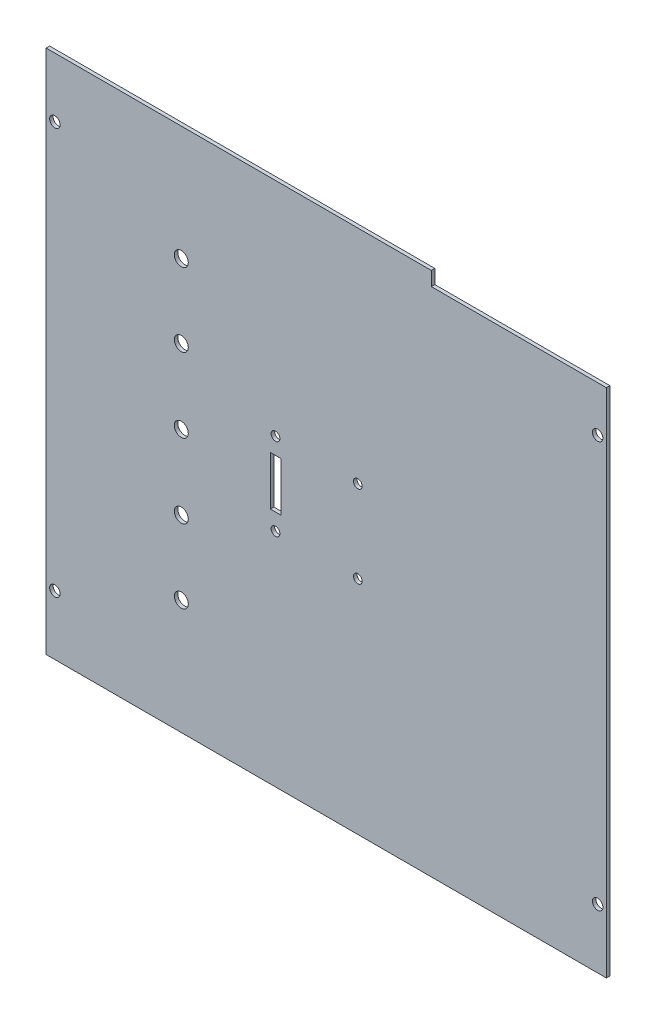
ISO-10303-21;
HEADER;
FILE_DESCRIPTION(('STEP AP214'),'2;1');
FILE_NAME('part.step','',(''),(''),'','','');
FILE_SCHEMA(('AUTOMOTIVE_DESIGN { 1 0 10303 214 1 1 1 1 }'));
ENDSEC;
DATA;
#1=APPLICATION_CONTEXT('core data for automotive mechanical design processes');
#2=APPLICATION_PROTOCOL_DEFINITION('international standard','automotive_design',2000,#1);
#3=PRODUCT_CONTEXT('',#1,'mechanical');
#4=PRODUCT('Part','Part','',(#3));
#5=PRODUCT_RELATED_PRODUCT_CATEGORY('part','',(#4));
#6=PRODUCT_DEFINITION_FORMATION('','',#4);
#7=PRODUCT_DEFINITION_CONTEXT('part definition',#1,'design');
#8=PRODUCT_DEFINITION('design','',#6,#7);
#9=PRODUCT_DEFINITION_SHAPE('','',#8);
#10=(LENGTH_UNIT() NAMED_UNIT(*) SI_UNIT(.MILLI.,.METRE.));
#11=(NAMED_UNIT(*) PLANE_ANGLE_UNIT() SI_UNIT($,.RADIAN.));
#12=(NAMED_UNIT(*) SI_UNIT($,.STERADIAN.) SOLID_ANGLE_UNIT());
#13=UNCERTAINTY_MEASURE_WITH_UNIT(LENGTH_MEASURE(1.E-05),#10,'distance_accuracy_value','');
#14=(GEOMETRIC_REPRESENTATION_CONTEXT(3) GLOBAL_UNCERTAINTY_ASSIGNED_CONTEXT((#13)) GLOBAL_UNIT_ASSIGNED_CONTEXT((#10,
#11,#12)) REPRESENTATION_CONTEXT('',''));
#15=CARTESIAN_POINT('',(0.,0.,0.));
#16=DIRECTION('',(0.,0.,1.));
#17=DIRECTION('',(1.,0.,0.));
#18=AXIS2_PLACEMENT_3D('',#15,#16,#17);
#19=CARTESIAN_POINT('',(80.,75.,1.));
#20=DIRECTION('',(-1.,0.,0.));
#21=DIRECTION('',(0.,0.,1.));
#22=AXIS2_PLACEMENT_3D('',#19,#20,#21);
#23=PLANE('',#22);
#24=DIRECTION('',(0.,1.,0.));
#25=VECTOR('',#24,1.);
#26=CARTESIAN_POINT('',(80.,75.,0.));
#27=LINE('',#26,#25);
#28=CARTESIAN_POINT('',(80.,-75.,0.));
#29=VERTEX_POINT('',#28);
#30=CARTESIAN_POINT('',(80.,71.,0.));
#31=VERTEX_POINT('',#30);
#32=EDGE_CURVE('E196',#29,#31,#27,.T.);
#33=ORIENTED_EDGE('',*,*,#32,.T.);
#34=DIRECTION('',(0.,0.,1.));
#35=VECTOR('',#34,1.);
#36=CARTESIAN_POINT('',(80.,71.,-9.));
#37=LINE('',#36,#35);
#38=CARTESIAN_POINT('',(80.,71.,1.));
#39=VERTEX_POINT('',#38);
#40=EDGE_CURVE('E167',#31,#39,#37,.T.);
#41=ORIENTED_EDGE('',*,*,#40,.T.);
#42=DIRECTION('',(0.,1.,0.));
#43=VECTOR('',#42,1.);
#44=CARTESIAN_POINT('',(80.,75.,1.));
#45=LINE('',#44,#43);
#46=CARTESIAN_POINT('',(80.,-75.,1.));
#47=VERTEX_POINT('',#46);
#48=EDGE_CURVE('E185',#47,#39,#45,.T.);
#49=ORIENTED_EDGE('',*,*,#48,.F.);
#50=DIRECTION('',(0.,0.,-1.));
#51=VECTOR('',#50,1.);
#52=CARTESIAN_POINT('',(80.,-75.,1.));
#53=LINE('',#52,#51);
#54=EDGE_CURVE('E195',#47,#29,#53,.T.);
#55=ORIENTED_EDGE('',*,*,#54,.T.);
#56=EDGE_LOOP('',(#33,#41,#49,#55));
#57=FACE_BOUND('',#56,.T.);
#58=ADVANCED_FACE('F33',(#57),#23,.F.);
#59=CARTESIAN_POINT('',(-80.,75.,1.));
#60=DIRECTION('',(0.,-1.,0.));
#61=DIRECTION('',(0.,0.,-1.));
#62=AXIS2_PLACEMENT_3D('',#59,#60,#61);
#63=PLANE('',#62);
#64=DIRECTION('',(-1.,0.,0.));
#65=VECTOR('',#64,1.);
#66=CARTESIAN_POINT('',(-80.,75.,1.));
#67=LINE('',#66,#65);
#68=CARTESIAN_POINT('',(30.,75.,1.));
#69=VERTEX_POINT('',#68);
#70=CARTESIAN_POINT('',(-80.,75.,1.));
#71=VERTEX_POINT('',#70);
#72=EDGE_CURVE('E188',#69,#71,#67,.T.);
#73=ORIENTED_EDGE('',*,*,#72,.F.);
#74=DIRECTION('',(0.,0.,1.));
#75=VECTOR('',#74,1.);
#76=CARTESIAN_POINT('',(30.,75.,-9.));
#77=LINE('',#76,#75);
#78=CARTESIAN_POINT('',(30.,75.,0.));
#79=VERTEX_POINT('',#78);
#80=EDGE_CURVE('E171',#79,#69,#77,.T.);
#81=ORIENTED_EDGE('',*,*,#80,.F.);
#82=DIRECTION('',(-1.,0.,0.));
#83=VECTOR('',#82,1.);
#84=CARTESIAN_POINT('',(-80.,75.,0.));
#85=LINE('',#84,#83);
#86=CARTESIAN_POINT('',(-80.,75.,0.));
#87=VERTEX_POINT('',#86);
#88=EDGE_CURVE('E199',#79,#87,#85,.T.);
#89=ORIENTED_EDGE('',*,*,#88,.T.);
#90=DIRECTION('',(0.,0.,-1.));
#91=VECTOR('',#90,1.);
#92=CARTESIAN_POINT('',(-80.,75.,1.));
#93=LINE('',#92,#91);
#94=EDGE_CURVE('E209',#71,#87,#93,.T.);
#95=ORIENTED_EDGE('',*,*,#94,.F.);
#96=EDGE_LOOP('',(#73,#81,#89,#95));
#97=FACE_BOUND('',#96,.T.);
#98=ADVANCED_FACE('F276',(#97),#63,.F.);
#99=CARTESIAN_POINT('',(-80.,75.,1.));
#100=DIRECTION('',(1.,0.,0.));
#101=DIRECTION('',(0.,1.,0.));
#102=AXIS2_PLACEMENT_3D('',#99,#100,#101);
#103=PLANE('',#102);
#104=DIRECTION('',(0.,-1.,0.));
#105=VECTOR('',#104,1.);
#106=CARTESIAN_POINT('',(-80.,75.,0.));
#107=LINE('',#106,#105);
#108=CARTESIAN_POINT('',(-80.,-75.,0.));
#109=VERTEX_POINT('',#108);
#110=EDGE_CURVE('E201',#87,#109,#107,.T.);
#111=ORIENTED_EDGE('',*,*,#110,.T.);
#112=DIRECTION('',(0.,0.,-1.));
#113=VECTOR('',#112,1.);
#114=CARTESIAN_POINT('',(-80.,-75.,1.));
#115=LINE('',#114,#113);
#116=CARTESIAN_POINT('',(-80.,-75.,1.));
#117=VERTEX_POINT('',#116);
#118=EDGE_CURVE('E206',#117,#109,#115,.T.);
#119=ORIENTED_EDGE('',*,*,#118,.F.);
#120=DIRECTION('',(0.,-1.,0.));
#121=VECTOR('',#120,1.);
#122=CARTESIAN_POINT('',(-80.,75.,1.));
#123=LINE('',#122,#121);
#124=EDGE_CURVE('E191',#71,#117,#123,.T.);
#125=ORIENTED_EDGE('',*,*,#124,.F.);
#126=ORIENTED_EDGE('',*,*,#94,.T.);
#127=EDGE_LOOP('',(#111,#119,#125,#126));
#128=FACE_BOUND('',#127,.T.);
#129=ADVANCED_FACE('F281',(#128),#103,.F.);
#130=CARTESIAN_POINT('',(-80.,-75.,1.));
#131=DIRECTION('',(0.,1.,0.));
#132=DIRECTION('',(0.,0.,1.));
#133=AXIS2_PLACEMENT_3D('',#130,#131,#132);
#134=PLANE('',#133);
#135=DIRECTION('',(1.,0.,0.));
#136=VECTOR('',#135,1.);
#137=CARTESIAN_POINT('',(-80.,-75.,0.));
#138=LINE('',#137,#136);
#139=EDGE_CURVE('E189',#109,#29,#138,.T.);
#140=ORIENTED_EDGE('',*,*,#139,.T.);
#141=ORIENTED_EDGE('',*,*,#54,.F.);
#142=DIRECTION('',(1.,0.,0.));
#143=VECTOR('',#142,1.);
#144=CARTESIAN_POINT('',(-80.,-75.,1.));
#145=LINE('',#144,#143);
#146=EDGE_CURVE('E193',#117,#47,#145,.T.);
#147=ORIENTED_EDGE('',*,*,#146,.F.);
#148=ORIENTED_EDGE('',*,*,#118,.T.);
#149=EDGE_LOOP('',(#140,#141,#147,#148));
#150=FACE_BOUND('',#149,.T.);
#151=ADVANCED_FACE('F301',(#150),#134,.F.);
#152=CARTESIAN_POINT('',(0.,0.,1.));
#153=DIRECTION('',(0.,0.,1.));
#154=DIRECTION('',(1.,0.,0.));
#155=AXIS2_PLACEMENT_3D('',#152,#153,#154);
#156=PLANE('',#155);
#157=CARTESIAN_POINT('',(-14.4839159587222,11.75,1.));
#158=DIRECTION('',(0.,0.,1.));
#159=DIRECTION('',(-1.,0.,0.));
#160=AXIS2_PLACEMENT_3D('',#157,#158,#159);
#161=CIRCLE('',#160,1.25);
#162=CARTESIAN_POINT('',(-15.7339159587222,11.75,1.));
#163=VERTEX_POINT('',#162);
#164=EDGE_CURVE('E147',#163,#163,#161,.T.);
#165=ORIENTED_EDGE('',*,*,#164,.F.);
#166=EDGE_LOOP('',(#165));
#167=FACE_BOUND('',#166,.T.);
#168=CARTESIAN_POINT('',(9.01608404127784,11.75,1.));
#169=DIRECTION('',(0.,0.,1.));
#170=DIRECTION('',(-1.,0.,0.));
#171=AXIS2_PLACEMENT_3D('',#168,#169,#170);
#172=CIRCLE('',#171,1.25);
#173=CARTESIAN_POINT('',(7.76608404127784,11.75,1.));
#174=VERTEX_POINT('',#173);
#175=EDGE_CURVE('E158',#174,#174,#172,.T.);
#176=ORIENTED_EDGE('',*,*,#175,.F.);
#177=EDGE_LOOP('',(#176));
#178=FACE_BOUND('',#177,.T.);
#179=CARTESIAN_POINT('',(9.01608404127784,-11.75,1.));
#180=DIRECTION('',(0.,0.,1.));
#181=DIRECTION('',(1.,0.,0.));
#182=AXIS2_PLACEMENT_3D('',#179,#180,#181);
#183=CIRCLE('',#182,1.25);
#184=CARTESIAN_POINT('',(10.2660840412778,-11.75,1.));
#185=VERTEX_POINT('',#184);
#186=EDGE_CURVE('E155',#185,#185,#183,.T.);
#187=ORIENTED_EDGE('',*,*,#186,.F.);
#188=EDGE_LOOP('',(#187));
#189=FACE_BOUND('',#188,.T.);
#190=CARTESIAN_POINT('',(-14.4839159587222,-11.75,1.));
#191=DIRECTION('',(0.,0.,1.));
#192=DIRECTION('',(1.,0.,0.));
#193=AXIS2_PLACEMENT_3D('',#190,#191,#192);
#194=CIRCLE('',#193,1.25);
#195=CARTESIAN_POINT('',(-13.2339159587222,-11.75,1.));
#196=VERTEX_POINT('',#195);
#197=EDGE_CURVE('E151',#196,#196,#194,.T.);
#198=ORIENTED_EDGE('',*,*,#197,.F.);
#199=EDGE_LOOP('',(#198));
#200=FACE_BOUND('',#199,.T.);
#201=CARTESIAN_POINT('',(77.5,-58.,1.));
#202=DIRECTION('',(0.,0.,1.));
#203=DIRECTION('',(1.,0.,0.));
#204=AXIS2_PLACEMENT_3D('',#201,#202,#203);
#205=CIRCLE('',#204,1.5);
#206=CARTESIAN_POINT('',(79.,-58.,1.));
#207=VERTEX_POINT('',#206);
#208=EDGE_CURVE('E176',#207,#207,#205,.T.);
#209=ORIENTED_EDGE('',*,*,#208,.F.);
#210=EDGE_LOOP('',(#209));
#211=FACE_BOUND('',#210,.T.);
#212=CARTESIAN_POINT('',(77.5,58.,1.));
#213=DIRECTION('',(0.,0.,1.));
#214=DIRECTION('',(-1.,0.,0.));
#215=AXIS2_PLACEMENT_3D('',#212,#213,#214);
#216=CIRCLE('',#215,1.5);
#217=CARTESIAN_POINT('',(76.,58.,1.));
#218=VERTEX_POINT('',#217);
#219=EDGE_CURVE('E166',#218,#218,#216,.T.);
#220=ORIENTED_EDGE('',*,*,#219,.F.);
#221=EDGE_LOOP('',(#220));
#222=FACE_BOUND('',#221,.T.);
#223=CARTESIAN_POINT('',(-77.5,58.,1.));
#224=DIRECTION('',(0.,0.,1.));
#225=DIRECTION('',(-1.,0.,0.));
#226=AXIS2_PLACEMENT_3D('',#223,#224,#225);
#227=CIRCLE('',#226,1.5);
#228=CARTESIAN_POINT('',(-79.,58.,1.));
#229=VERTEX_POINT('',#228);
#230=EDGE_CURVE('E163',#229,#229,#227,.T.);
#231=ORIENTED_EDGE('',*,*,#230,.F.);
#232=EDGE_LOOP('',(#231));
#233=FACE_BOUND('',#232,.T.);
#234=DIRECTION('',(1.,0.,0.));
#235=VECTOR('',#234,1.);
#236=CARTESIAN_POINT('',(80.,71.,1.));
#237=LINE('',#236,#235);
#238=CARTESIAN_POINT('',(30.,71.,1.));
#239=VERTEX_POINT('',#238);
#240=EDGE_CURVE('E169',#239,#39,#237,.T.);
#241=ORIENTED_EDGE('',*,*,#240,.F.);
#242=DIRECTION('',(0.,-1.,0.));
#243=VECTOR('',#242,1.);
#244=CARTESIAN_POINT('',(30.,75.,1.));
#245=LINE('',#244,#243);
#246=EDGE_CURVE('E154',#69,#239,#245,.T.);
#247=ORIENTED_EDGE('',*,*,#246,.F.);
#248=ORIENTED_EDGE('',*,*,#72,.T.);
#249=ORIENTED_EDGE('',*,*,#124,.T.);
#250=ORIENTED_EDGE('',*,*,#146,.T.);
#251=ORIENTED_EDGE('',*,*,#48,.T.);
#252=EDGE_LOOP('',(#241,#247,#248,#249,#250,#251));
#253=FACE_BOUND('',#252,.T.);
#254=CARTESIAN_POINT('',(-41.4014767297682,42.218866746657,1.));
#255=DIRECTION('',(0.,0.,1.));
#256=DIRECTION('',(-1.,0.,0.));
#257=AXIS2_PLACEMENT_3D('',#254,#255,#256);
#258=CIRCLE('',#257,2.);
#259=CARTESIAN_POINT('',(-43.4014767297682,42.218866746657,1.));
#260=VERTEX_POINT('',#259);
#261=EDGE_CURVE('E511',#260,#260,#258,.T.);
#262=ORIENTED_EDGE('',*,*,#261,.F.);
#263=EDGE_LOOP('',(#262));
#264=FACE_BOUND('',#263,.T.);
#265=CARTESIAN_POINT('',(-41.4014767297682,-42.218866746657,1.));
#266=DIRECTION('',(0.,0.,1.));
#267=DIRECTION('',(1.,0.,0.));
#268=AXIS2_PLACEMENT_3D('',#265,#266,#267);
#269=CIRCLE('',#268,2.);
#270=CARTESIAN_POINT('',(-39.4014767297682,-42.218866746657,1.));
#271=VERTEX_POINT('',#270);
#272=EDGE_CURVE('E509',#271,#271,#269,.T.);
#273=ORIENTED_EDGE('',*,*,#272,.F.);
#274=EDGE_LOOP('',(#273));
#275=FACE_BOUND('',#274,.T.);
#276=CARTESIAN_POINT('',(-41.4014767297682,0.,1.));
#277=DIRECTION('',(0.,0.,1.));
#278=DIRECTION('',(1.,0.,0.));
#279=AXIS2_PLACEMENT_3D('',#276,#277,#278);
#280=CIRCLE('',#279,2.);
#281=CARTESIAN_POINT('',(-39.4014767297682,0.,1.));
#282=VERTEX_POINT('',#281);
#283=EDGE_CURVE('E144',#282,#282,#280,.T.);
#284=ORIENTED_EDGE('',*,*,#283,.F.);
#285=EDGE_LOOP('',(#284));
#286=FACE_BOUND('',#285,.T.);
#287=CARTESIAN_POINT('',(-41.4014767297682,-21.2156769889961,1.));
#288=DIRECTION('',(0.,0.,1.));
#289=DIRECTION('',(1.,0.,0.));
#290=AXIS2_PLACEMENT_3D('',#287,#288,#289);
#291=CIRCLE('',#290,2.);
#292=CARTESIAN_POINT('',(-39.4014767297682,-21.2156769889961,1.));
#293=VERTEX_POINT('',#292);
#294=EDGE_CURVE('E148',#293,#293,#291,.T.);
#295=ORIENTED_EDGE('',*,*,#294,.F.);
#296=EDGE_LOOP('',(#295));
#297=FACE_BOUND('',#296,.T.);
#298=CARTESIAN_POINT('',(-41.4014767297682,21.2156769889961,1.));
#299=DIRECTION('',(0.,0.,1.));
#300=DIRECTION('',(-1.,0.,0.));
#301=AXIS2_PLACEMENT_3D('',#298,#299,#300);
#302=CIRCLE('',#301,2.);
#303=CARTESIAN_POINT('',(-43.4014767297682,21.2156769889961,1.));
#304=VERTEX_POINT('',#303);
#305=EDGE_CURVE('E141',#304,#304,#302,.T.);
#306=ORIENTED_EDGE('',*,*,#305,.F.);
#307=EDGE_LOOP('',(#306));
#308=FACE_BOUND('',#307,.T.);
#309=DIRECTION('',(0.,1.,0.));
#310=VECTOR('',#309,1.);
#311=CARTESIAN_POINT('',(-12.9839159587222,-7.00000000000002,1.));
#312=LINE('',#311,#310);
#313=CARTESIAN_POINT('',(-12.9839159587222,-7.00000000000002,1.));
#314=VERTEX_POINT('',#313);
#315=CARTESIAN_POINT('',(-12.9839159587222,6.99999999999998,1.));
#316=VERTEX_POINT('',#315);
#317=EDGE_CURVE('E49',#314,#316,#312,.T.);
#318=ORIENTED_EDGE('',*,*,#317,.F.);
#319=DIRECTION('',(1.,0.,0.));
#320=VECTOR('',#319,1.);
#321=CARTESIAN_POINT('',(-15.9839159587222,-7.00000000000002,1.));
#322=LINE('',#321,#320);
#323=CARTESIAN_POINT('',(-15.9839159587222,-7.00000000000002,1.));
#324=VERTEX_POINT('',#323);
#325=EDGE_CURVE('E134',#324,#314,#322,.T.);
#326=ORIENTED_EDGE('',*,*,#325,.F.);
#327=DIRECTION('',(0.,-1.,0.));
#328=VECTOR('',#327,1.);
#329=CARTESIAN_POINT('',(-15.9839159587222,-7.00000000000002,1.));
#330=LINE('',#329,#328);
#331=CARTESIAN_POINT('',(-15.9839159587222,6.99999999999998,1.));
#332=VERTEX_POINT('',#331);
#333=EDGE_CURVE('E117',#332,#324,#330,.T.);
#334=ORIENTED_EDGE('',*,*,#333,.F.);
#335=DIRECTION('',(-1.,0.,0.));
#336=VECTOR('',#335,1.);
#337=CARTESIAN_POINT('',(-15.9839159587222,6.99999999999998,1.));
#338=LINE('',#337,#336);
#339=EDGE_CURVE('E127',#316,#332,#338,.T.);
#340=ORIENTED_EDGE('',*,*,#339,.F.);
#341=EDGE_LOOP('',(#318,#326,#334,#340));
#342=FACE_BOUND('',#341,.T.);
#343=CARTESIAN_POINT('',(-77.5,-58.,1.));
#344=DIRECTION('',(0.,0.,1.));
#345=DIRECTION('',(1.,0.,0.));
#346=AXIS2_PLACEMENT_3D('',#343,#344,#345);
#347=CIRCLE('',#346,1.5);
#348=CARTESIAN_POINT('',(-76.,-58.,1.));
#349=VERTEX_POINT('',#348);
#350=EDGE_CURVE('E179',#349,#349,#347,.T.);
#351=ORIENTED_EDGE('',*,*,#350,.F.);
#352=EDGE_LOOP('',(#351));
#353=FACE_BOUND('',#352,.T.);
#354=ADVANCED_FACE('F131',(#167,#178,#189,#200,#211,#222,#233,#253,#264,#275,#286,#297,#308,
#342,#353),#156,.T.);
#355=CARTESIAN_POINT('',(0.,0.,0.));
#356=DIRECTION('',(0.,0.,1.));
#357=DIRECTION('',(1.,0.,0.));
#358=AXIS2_PLACEMENT_3D('',#355,#356,#357);
#359=PLANE('',#358);
#360=CARTESIAN_POINT('',(-14.4839159587222,11.75,0.));
#361=DIRECTION('',(0.,0.,1.));
#362=DIRECTION('',(1.,0.,0.));
#363=AXIS2_PLACEMENT_3D('',#360,#361,#362);
#364=CIRCLE('',#363,1.25);
#365=CARTESIAN_POINT('',(-13.2339159587222,11.75,0.));
#366=VERTEX_POINT('',#365);
#367=EDGE_CURVE('E36',#366,#366,#364,.T.);
#368=ORIENTED_EDGE('',*,*,#367,.T.);
#369=EDGE_LOOP('',(#368));
#370=FACE_BOUND('',#369,.T.);
#371=CARTESIAN_POINT('',(9.01608404127784,11.75,0.));
#372=DIRECTION('',(0.,0.,1.));
#373=DIRECTION('',(1.,0.,0.));
#374=AXIS2_PLACEMENT_3D('',#371,#372,#373);
#375=CIRCLE('',#374,1.25);
#376=CARTESIAN_POINT('',(10.2660840412778,11.75,0.));
#377=VERTEX_POINT('',#376);
#378=EDGE_CURVE('E254',#377,#377,#375,.T.);
#379=ORIENTED_EDGE('',*,*,#378,.T.);
#380=EDGE_LOOP('',(#379));
#381=FACE_BOUND('',#380,.T.);
#382=CARTESIAN_POINT('',(9.01608404127784,-11.75,0.));
#383=DIRECTION('',(0.,0.,1.));
#384=DIRECTION('',(1.,0.,0.));
#385=AXIS2_PLACEMENT_3D('',#382,#383,#384);
#386=CIRCLE('',#385,1.25);
#387=CARTESIAN_POINT('',(10.2660840412778,-11.75,0.));
#388=VERTEX_POINT('',#387);
#389=EDGE_CURVE('E252',#388,#388,#386,.T.);
#390=ORIENTED_EDGE('',*,*,#389,.T.);
#391=EDGE_LOOP('',(#390));
#392=FACE_BOUND('',#391,.T.);
#393=CARTESIAN_POINT('',(-14.4839159587222,-11.75,0.));
#394=DIRECTION('',(0.,0.,1.));
#395=DIRECTION('',(1.,0.,0.));
#396=AXIS2_PLACEMENT_3D('',#393,#394,#395);
#397=CIRCLE('',#396,1.25);
#398=CARTESIAN_POINT('',(-13.2339159587222,-11.75,0.));
#399=VERTEX_POINT('',#398);
#400=EDGE_CURVE('E249',#399,#399,#397,.T.);
#401=ORIENTED_EDGE('',*,*,#400,.T.);
#402=EDGE_LOOP('',(#401));
#403=FACE_BOUND('',#402,.T.);
#404=CARTESIAN_POINT('',(77.5,-58.,0.));
#405=DIRECTION('',(0.,0.,1.));
#406=DIRECTION('',(1.,0.,0.));
#407=AXIS2_PLACEMENT_3D('',#404,#405,#406);
#408=CIRCLE('',#407,1.5);
#409=CARTESIAN_POINT('',(79.,-58.,0.));
#410=VERTEX_POINT('',#409);
#411=EDGE_CURVE('E246',#410,#410,#408,.T.);
#412=ORIENTED_EDGE('',*,*,#411,.T.);
#413=EDGE_LOOP('',(#412));
#414=FACE_BOUND('',#413,.T.);
#415=CARTESIAN_POINT('',(77.5,58.,0.));
#416=DIRECTION('',(0.,0.,1.));
#417=DIRECTION('',(1.,0.,0.));
#418=AXIS2_PLACEMENT_3D('',#415,#416,#417);
#419=CIRCLE('',#418,1.5);
#420=CARTESIAN_POINT('',(79.,58.,0.));
#421=VERTEX_POINT('',#420);
#422=EDGE_CURVE('E243',#421,#421,#419,.T.);
#423=ORIENTED_EDGE('',*,*,#422,.T.);
#424=EDGE_LOOP('',(#423));
#425=FACE_BOUND('',#424,.T.);
#426=CARTESIAN_POINT('',(-77.5,58.,0.));
#427=DIRECTION('',(0.,0.,1.));
#428=DIRECTION('',(1.,0.,0.));
#429=AXIS2_PLACEMENT_3D('',#426,#427,#428);
#430=CIRCLE('',#429,1.5);
#431=CARTESIAN_POINT('',(-76.,58.,0.));
#432=VERTEX_POINT('',#431);
#433=EDGE_CURVE('E238',#432,#432,#430,.T.);
#434=ORIENTED_EDGE('',*,*,#433,.T.);
#435=EDGE_LOOP('',(#434));
#436=FACE_BOUND('',#435,.T.);
#437=CARTESIAN_POINT('',(-41.4014767297682,42.218866746657,0.));
#438=DIRECTION('',(0.,0.,1.));
#439=DIRECTION('',(1.,0.,0.));
#440=AXIS2_PLACEMENT_3D('',#437,#438,#439);
#441=CIRCLE('',#440,2.);
#442=CARTESIAN_POINT('',(-39.4014767297682,42.218866746657,0.));
#443=VERTEX_POINT('',#442);
#444=EDGE_CURVE('E235',#443,#443,#441,.T.);
#445=ORIENTED_EDGE('',*,*,#444,.T.);
#446=EDGE_LOOP('',(#445));
#447=FACE_BOUND('',#446,.T.);
#448=CARTESIAN_POINT('',(-41.4014767297682,-42.218866746657,0.));
#449=DIRECTION('',(0.,0.,1.));
#450=DIRECTION('',(1.,0.,0.));
#451=AXIS2_PLACEMENT_3D('',#448,#449,#450);
#452=CIRCLE('',#451,2.);
#453=CARTESIAN_POINT('',(-39.4014767297682,-42.218866746657,0.));
#454=VERTEX_POINT('',#453);
#455=EDGE_CURVE('E232',#454,#454,#452,.T.);
#456=ORIENTED_EDGE('',*,*,#455,.T.);
#457=EDGE_LOOP('',(#456));
#458=FACE_BOUND('',#457,.T.);
#459=CARTESIAN_POINT('',(-41.4014767297682,0.,0.));
#460=DIRECTION('',(0.,0.,1.));
#461=DIRECTION('',(1.,0.,0.));
#462=AXIS2_PLACEMENT_3D('',#459,#460,#461);
#463=CIRCLE('',#462,2.);
#464=CARTESIAN_POINT('',(-39.4014767297682,0.,0.));
#465=VERTEX_POINT('',#464);
#466=EDGE_CURVE('E229',#465,#465,#463,.T.);
#467=ORIENTED_EDGE('',*,*,#466,.T.);
#468=EDGE_LOOP('',(#467));
#469=FACE_BOUND('',#468,.T.);
#470=CARTESIAN_POINT('',(-41.4014767297682,-21.2156769889961,0.));
#471=DIRECTION('',(0.,0.,1.));
#472=DIRECTION('',(1.,0.,0.));
#473=AXIS2_PLACEMENT_3D('',#470,#471,#472);
#474=CIRCLE('',#473,2.);
#475=CARTESIAN_POINT('',(-39.4014767297682,-21.2156769889961,0.));
#476=VERTEX_POINT('',#475);
#477=EDGE_CURVE('E226',#476,#476,#474,.T.);
#478=ORIENTED_EDGE('',*,*,#477,.T.);
#479=EDGE_LOOP('',(#478));
#480=FACE_BOUND('',#479,.T.);
#481=CARTESIAN_POINT('',(-41.4014767297682,21.2156769889961,0.));
#482=DIRECTION('',(0.,0.,1.));
#483=DIRECTION('',(1.,0.,0.));
#484=AXIS2_PLACEMENT_3D('',#481,#482,#483);
#485=CIRCLE('',#484,2.);
#486=CARTESIAN_POINT('',(-39.4014767297682,21.2156769889961,0.));
#487=VERTEX_POINT('',#486);
#488=EDGE_CURVE('E215',#487,#487,#485,.T.);
#489=ORIENTED_EDGE('',*,*,#488,.T.);
#490=EDGE_LOOP('',(#489));
#491=FACE_BOUND('',#490,.T.);
#492=DIRECTION('',(1.,0.,0.));
#493=VECTOR('',#492,1.);
#494=CARTESIAN_POINT('',(0.,-7.00000000000002,0.));
#495=LINE('',#494,#493);
#496=CARTESIAN_POINT('',(-15.9839159587222,-7.00000000000002,0.));
#497=VERTEX_POINT('',#496);
#498=CARTESIAN_POINT('',(-12.9839159587222,-7.00000000000002,0.));
#499=VERTEX_POINT('',#498);
#500=EDGE_CURVE('E218',#497,#499,#495,.T.);
#501=ORIENTED_EDGE('',*,*,#500,.T.);
#502=DIRECTION('',(0.,1.,0.));
#503=VECTOR('',#502,1.);
#504=CARTESIAN_POINT('',(-12.9839159587222,0.,0.));
#505=LINE('',#504,#503);
#506=CARTESIAN_POINT('',(-12.9839159587222,6.99999999999998,0.));
#507=VERTEX_POINT('',#506);
#508=EDGE_CURVE('E221',#499,#507,#505,.T.);
#509=ORIENTED_EDGE('',*,*,#508,.T.);
#510=DIRECTION('',(-1.,0.,0.));
#511=VECTOR('',#510,1.);
#512=CARTESIAN_POINT('',(0.,6.99999999999998,0.));
#513=LINE('',#512,#511);
#514=CARTESIAN_POINT('',(-15.9839159587222,6.99999999999998,0.));
#515=VERTEX_POINT('',#514);
#516=EDGE_CURVE('E212',#507,#515,#513,.T.);
#517=ORIENTED_EDGE('',*,*,#516,.T.);
#518=DIRECTION('',(0.,-1.,0.));
#519=VECTOR('',#518,1.);
#520=CARTESIAN_POINT('',(-15.9839159587222,0.,0.));
#521=LINE('',#520,#519);
#522=EDGE_CURVE('E120',#515,#497,#521,.T.);
#523=ORIENTED_EDGE('',*,*,#522,.T.);
#524=EDGE_LOOP('',(#501,#509,#517,#523));
#525=FACE_BOUND('',#524,.T.);
#526=CARTESIAN_POINT('',(-77.5,-58.,0.));
#527=DIRECTION('',(0.,0.,1.));
#528=DIRECTION('',(1.,0.,0.));
#529=AXIS2_PLACEMENT_3D('',#526,#527,#528);
#530=CIRCLE('',#529,1.5);
#531=CARTESIAN_POINT('',(-76.,-58.,0.));
#532=VERTEX_POINT('',#531);
#533=EDGE_CURVE('E184',#532,#532,#530,.T.);
#534=ORIENTED_EDGE('',*,*,#533,.T.);
#535=EDGE_LOOP('',(#534));
#536=FACE_BOUND('',#535,.T.);
#537=DIRECTION('',(0.,-1.,0.));
#538=VECTOR('',#537,1.);
#539=CARTESIAN_POINT('',(30.,0.,0.));
#540=LINE('',#539,#538);
#541=CARTESIAN_POINT('',(30.,71.,0.));
#542=VERTEX_POINT('',#541);
#543=EDGE_CURVE('E41',#79,#542,#540,.T.);
#544=ORIENTED_EDGE('',*,*,#543,.T.);
#545=DIRECTION('',(1.,0.,0.));
#546=VECTOR('',#545,1.);
#547=CARTESIAN_POINT('',(0.,71.,0.));
#548=LINE('',#547,#546);
#549=EDGE_CURVE('E11',#542,#31,#548,.T.);
#550=ORIENTED_EDGE('',*,*,#549,.T.);
#551=ORIENTED_EDGE('',*,*,#32,.F.);
#552=ORIENTED_EDGE('',*,*,#139,.F.);
#553=ORIENTED_EDGE('',*,*,#110,.F.);
#554=ORIENTED_EDGE('',*,*,#88,.F.);
#555=EDGE_LOOP('',(#544,#550,#551,#552,#553,#554));
#556=FACE_BOUND('',#555,.T.);
#557=ADVANCED_FACE('F261',(#370,#381,#392,#403,#414,#425,#436,#447,#458,#469,#480,#491,#525,
#536,#556),#359,.F.);
#558=CARTESIAN_POINT('',(-77.5,-58.,-9.));
#559=DIRECTION('',(0.,0.,1.));
#560=DIRECTION('',(1.,0.,0.));
#561=AXIS2_PLACEMENT_3D('',#558,#559,#560);
#562=CYLINDRICAL_SURFACE('',#561,1.5);
#563=ORIENTED_EDGE('',*,*,#350,.T.);
#564=EDGE_LOOP('',(#563));
#565=FACE_BOUND('',#564,.T.);
#566=ORIENTED_EDGE('',*,*,#533,.F.);
#567=EDGE_LOOP('',(#566));
#568=FACE_BOUND('',#567,.T.);
#569=ADVANCED_FACE('F326',(#565,#568),#562,.F.);
#570=CARTESIAN_POINT('',(-12.9839159587222,-7.00000000000002,-9.));
#571=DIRECTION('',(1.,0.,0.));
#572=DIRECTION('',(0.,0.,-1.));
#573=AXIS2_PLACEMENT_3D('',#570,#571,#572);
#574=PLANE('',#573);
#575=DIRECTION('',(0.,0.,1.));
#576=VECTOR('',#575,1.);
#577=CARTESIAN_POINT('',(-12.9839159587222,-7.00000000000002,-9.));
#578=LINE('',#577,#576);
#579=EDGE_CURVE('E139',#499,#314,#578,.T.);
#580=ORIENTED_EDGE('',*,*,#579,.T.);
#581=ORIENTED_EDGE('',*,*,#317,.T.);
#582=DIRECTION('',(0.,0.,1.));
#583=VECTOR('',#582,1.);
#584=CARTESIAN_POINT('',(-12.9839159587222,6.99999999999998,-9.));
#585=LINE('',#584,#583);
#586=EDGE_CURVE('E124',#507,#316,#585,.T.);
#587=ORIENTED_EDGE('',*,*,#586,.F.);
#588=ORIENTED_EDGE('',*,*,#508,.F.);
#589=EDGE_LOOP('',(#580,#581,#587,#588));
#590=FACE_BOUND('',#589,.T.);
#591=ADVANCED_FACE('F329',(#590),#574,.F.);
#592=CARTESIAN_POINT('',(-15.9839159587222,-7.00000000000002,-9.));
#593=DIRECTION('',(0.,-1.,0.));
#594=DIRECTION('',(0.,0.,-1.));
#595=AXIS2_PLACEMENT_3D('',#592,#593,#594);
#596=PLANE('',#595);
#597=DIRECTION('',(0.,0.,1.));
#598=VECTOR('',#597,1.);
#599=CARTESIAN_POINT('',(-15.9839159587222,-7.00000000000002,-9.));
#600=LINE('',#599,#598);
#601=EDGE_CURVE('E123',#497,#324,#600,.T.);
#602=ORIENTED_EDGE('',*,*,#601,.T.);
#603=ORIENTED_EDGE('',*,*,#325,.T.);
#604=ORIENTED_EDGE('',*,*,#579,.F.);
#605=ORIENTED_EDGE('',*,*,#500,.F.);
#606=EDGE_LOOP('',(#602,#603,#604,#605));
#607=FACE_BOUND('',#606,.T.);
#608=ADVANCED_FACE('F365',(#607),#596,.F.);
#609=CARTESIAN_POINT('',(-15.9839159587222,-7.00000000000002,-9.));
#610=DIRECTION('',(-1.,0.,0.));
#611=DIRECTION('',(0.,0.,1.));
#612=AXIS2_PLACEMENT_3D('',#609,#610,#611);
#613=PLANE('',#612);
#614=DIRECTION('',(0.,0.,1.));
#615=VECTOR('',#614,1.);
#616=CARTESIAN_POINT('',(-15.9839159587222,6.99999999999998,-9.));
#617=LINE('',#616,#615);
#618=EDGE_CURVE('E112',#515,#332,#617,.T.);
#619=ORIENTED_EDGE('',*,*,#618,.T.);
#620=ORIENTED_EDGE('',*,*,#333,.T.);
#621=ORIENTED_EDGE('',*,*,#601,.F.);
#622=ORIENTED_EDGE('',*,*,#522,.F.);
#623=EDGE_LOOP('',(#619,#620,#621,#622));
#624=FACE_BOUND('',#623,.T.);
#625=ADVANCED_FACE('F114',(#624),#613,.F.);
#626=CARTESIAN_POINT('',(-15.9839159587222,6.99999999999998,-9.));
#627=DIRECTION('',(0.,1.,0.));
#628=DIRECTION('',(0.,0.,1.));
#629=AXIS2_PLACEMENT_3D('',#626,#627,#628);
#630=PLANE('',#629);
#631=ORIENTED_EDGE('',*,*,#586,.T.);
#632=ORIENTED_EDGE('',*,*,#339,.T.);
#633=ORIENTED_EDGE('',*,*,#618,.F.);
#634=ORIENTED_EDGE('',*,*,#516,.F.);
#635=EDGE_LOOP('',(#631,#632,#633,#634));
#636=FACE_BOUND('',#635,.T.);
#637=ADVANCED_FACE('F128',(#636),#630,.F.);
#638=CARTESIAN_POINT('',(-41.4014767297682,21.2156769889961,-9.));
#639=DIRECTION('',(0.,0.,1.));
#640=DIRECTION('',(1.,0.,0.));
#641=AXIS2_PLACEMENT_3D('',#638,#639,#640);
#642=CYLINDRICAL_SURFACE('',#641,2.);
#643=ORIENTED_EDGE('',*,*,#305,.T.);
#644=EDGE_LOOP('',(#643));
#645=FACE_BOUND('',#644,.T.);
#646=ORIENTED_EDGE('',*,*,#488,.F.);
#647=EDGE_LOOP('',(#646));
#648=FACE_BOUND('',#647,.T.);
#649=ADVANCED_FACE('F385',(#645,#648),#642,.F.);
#650=CARTESIAN_POINT('',(-41.4014767297682,-21.2156769889961,-9.));
#651=DIRECTION('',(0.,0.,1.));
#652=DIRECTION('',(1.,0.,0.));
#653=AXIS2_PLACEMENT_3D('',#650,#651,#652);
#654=CYLINDRICAL_SURFACE('',#653,2.);
#655=ORIENTED_EDGE('',*,*,#294,.T.);
#656=EDGE_LOOP('',(#655));
#657=FACE_BOUND('',#656,.T.);
#658=ORIENTED_EDGE('',*,*,#477,.F.);
#659=EDGE_LOOP('',(#658));
#660=FACE_BOUND('',#659,.T.);
#661=ADVANCED_FACE('F392',(#657,#660),#654,.F.);
#662=CARTESIAN_POINT('',(-41.4014767297682,0.,-9.));
#663=DIRECTION('',(0.,0.,1.));
#664=DIRECTION('',(1.,0.,0.));
#665=AXIS2_PLACEMENT_3D('',#662,#663,#664);
#666=CYLINDRICAL_SURFACE('',#665,2.);
#667=ORIENTED_EDGE('',*,*,#283,.T.);
#668=EDGE_LOOP('',(#667));
#669=FACE_BOUND('',#668,.T.);
#670=ORIENTED_EDGE('',*,*,#466,.F.);
#671=EDGE_LOOP('',(#670));
#672=FACE_BOUND('',#671,.T.);
#673=ADVANCED_FACE('F400',(#669,#672),#666,.F.);
#674=CARTESIAN_POINT('',(-41.4014767297682,-42.218866746657,-9.));
#675=DIRECTION('',(0.,0.,1.));
#676=DIRECTION('',(1.,0.,0.));
#677=AXIS2_PLACEMENT_3D('',#674,#675,#676);
#678=CYLINDRICAL_SURFACE('',#677,2.);
#679=ORIENTED_EDGE('',*,*,#272,.T.);
#680=EDGE_LOOP('',(#679));
#681=FACE_BOUND('',#680,.T.);
#682=ORIENTED_EDGE('',*,*,#455,.F.);
#683=EDGE_LOOP('',(#682));
#684=FACE_BOUND('',#683,.T.);
#685=ADVANCED_FACE('F408',(#681,#684),#678,.F.);
#686=CARTESIAN_POINT('',(-41.4014767297682,42.218866746657,-9.));
#687=DIRECTION('',(0.,0.,1.));
#688=DIRECTION('',(1.,0.,0.));
#689=AXIS2_PLACEMENT_3D('',#686,#687,#688);
#690=CYLINDRICAL_SURFACE('',#689,2.);
#691=ORIENTED_EDGE('',*,*,#261,.T.);
#692=EDGE_LOOP('',(#691));
#693=FACE_BOUND('',#692,.T.);
#694=ORIENTED_EDGE('',*,*,#444,.F.);
#695=EDGE_LOOP('',(#694));
#696=FACE_BOUND('',#695,.T.);
#697=ADVANCED_FACE('F315',(#693,#696),#690,.F.);
#698=CARTESIAN_POINT('',(80.,71.,-9.));
#699=DIRECTION('',(0.,-1.,0.));
#700=DIRECTION('',(0.,0.,-1.));
#701=AXIS2_PLACEMENT_3D('',#698,#699,#700);
#702=PLANE('',#701);
#703=DIRECTION('',(0.,0.,1.));
#704=VECTOR('',#703,1.);
#705=CARTESIAN_POINT('',(30.,71.,-9.));
#706=LINE('',#705,#704);
#707=EDGE_CURVE('E57',#542,#239,#706,.T.);
#708=ORIENTED_EDGE('',*,*,#707,.T.);
#709=ORIENTED_EDGE('',*,*,#240,.T.);
#710=ORIENTED_EDGE('',*,*,#40,.F.);
#711=ORIENTED_EDGE('',*,*,#549,.F.);
#712=EDGE_LOOP('',(#708,#709,#710,#711));
#713=FACE_BOUND('',#712,.T.);
#714=ADVANCED_FACE('F291',(#713),#702,.F.);
#715=CARTESIAN_POINT('',(30.,75.,-9.));
#716=DIRECTION('',(-1.,0.,0.));
#717=DIRECTION('',(0.,0.,1.));
#718=AXIS2_PLACEMENT_3D('',#715,#716,#717);
#719=PLANE('',#718);
#720=ORIENTED_EDGE('',*,*,#80,.T.);
#721=ORIENTED_EDGE('',*,*,#246,.T.);
#722=ORIENTED_EDGE('',*,*,#707,.F.);
#723=ORIENTED_EDGE('',*,*,#543,.F.);
#724=EDGE_LOOP('',(#720,#721,#722,#723));
#725=FACE_BOUND('',#724,.T.);
#726=ADVANCED_FACE('F305',(#725),#719,.F.);
#727=CARTESIAN_POINT('',(-77.5,58.,-9.));
#728=DIRECTION('',(0.,0.,1.));
#729=DIRECTION('',(1.,0.,0.));
#730=AXIS2_PLACEMENT_3D('',#727,#728,#729);
#731=CYLINDRICAL_SURFACE('',#730,1.5);
#732=ORIENTED_EDGE('',*,*,#230,.T.);
#733=EDGE_LOOP('',(#732));
#734=FACE_BOUND('',#733,.T.);
#735=ORIENTED_EDGE('',*,*,#433,.F.);
#736=EDGE_LOOP('',(#735));
#737=FACE_BOUND('',#736,.T.);
#738=ADVANCED_FACE('F307',(#734,#737),#731,.F.);
#739=CARTESIAN_POINT('',(77.5,58.,-9.));
#740=DIRECTION('',(0.,0.,1.));
#741=DIRECTION('',(1.,0.,0.));
#742=AXIS2_PLACEMENT_3D('',#739,#740,#741);
#743=CYLINDRICAL_SURFACE('',#742,1.5);
#744=ORIENTED_EDGE('',*,*,#219,.T.);
#745=EDGE_LOOP('',(#744));
#746=FACE_BOUND('',#745,.T.);
#747=ORIENTED_EDGE('',*,*,#422,.F.);
#748=EDGE_LOOP('',(#747));
#749=FACE_BOUND('',#748,.T.);
#750=ADVANCED_FACE('F313',(#746,#749),#743,.F.);
#751=CARTESIAN_POINT('',(77.5,-58.,-9.));
#752=DIRECTION('',(0.,0.,1.));
#753=DIRECTION('',(1.,0.,0.));
#754=AXIS2_PLACEMENT_3D('',#751,#752,#753);
#755=CYLINDRICAL_SURFACE('',#754,1.5);
#756=ORIENTED_EDGE('',*,*,#208,.T.);
#757=EDGE_LOOP('',(#756));
#758=FACE_BOUND('',#757,.T.);
#759=ORIENTED_EDGE('',*,*,#411,.F.);
#760=EDGE_LOOP('',(#759));
#761=FACE_BOUND('',#760,.T.);
#762=ADVANCED_FACE('F318',(#758,#761),#755,.F.);
#763=CARTESIAN_POINT('',(-14.4839159587222,-11.75,-9.));
#764=DIRECTION('',(0.,0.,1.));
#765=DIRECTION('',(1.,0.,0.));
#766=AXIS2_PLACEMENT_3D('',#763,#764,#765);
#767=CYLINDRICAL_SURFACE('',#766,1.25);
#768=ORIENTED_EDGE('',*,*,#197,.T.);
#769=EDGE_LOOP('',(#768));
#770=FACE_BOUND('',#769,.T.);
#771=ORIENTED_EDGE('',*,*,#400,.F.);
#772=EDGE_LOOP('',(#771));
#773=FACE_BOUND('',#772,.T.);
#774=ADVANCED_FACE('F321',(#770,#773),#767,.F.);
#775=CARTESIAN_POINT('',(9.01608404127784,-11.75,-9.));
#776=DIRECTION('',(0.,0.,1.));
#777=DIRECTION('',(1.,0.,0.));
#778=AXIS2_PLACEMENT_3D('',#775,#776,#777);
#779=CYLINDRICAL_SURFACE('',#778,1.25);
#780=ORIENTED_EDGE('',*,*,#186,.T.);
#781=EDGE_LOOP('',(#780));
#782=FACE_BOUND('',#781,.T.);
#783=ORIENTED_EDGE('',*,*,#389,.F.);
#784=EDGE_LOOP('',(#783));
#785=FACE_BOUND('',#784,.T.);
#786=ADVANCED_FACE('F271',(#782,#785),#779,.F.);
#787=CARTESIAN_POINT('',(9.01608404127784,11.75,-9.));
#788=DIRECTION('',(0.,0.,1.));
#789=DIRECTION('',(1.,0.,0.));
#790=AXIS2_PLACEMENT_3D('',#787,#788,#789);
#791=CYLINDRICAL_SURFACE('',#790,1.25);
#792=ORIENTED_EDGE('',*,*,#175,.T.);
#793=EDGE_LOOP('',(#792));
#794=FACE_BOUND('',#793,.T.);
#795=ORIENTED_EDGE('',*,*,#378,.F.);
#796=EDGE_LOOP('',(#795));
#797=FACE_BOUND('',#796,.T.);
#798=ADVANCED_FACE('F265',(#794,#797),#791,.F.);
#799=CARTESIAN_POINT('',(-14.4839159587222,11.75,-9.));
#800=DIRECTION('',(0.,0.,1.));
#801=DIRECTION('',(1.,0.,0.));
#802=AXIS2_PLACEMENT_3D('',#799,#800,#801);
#803=CYLINDRICAL_SURFACE('',#802,1.25);
#804=ORIENTED_EDGE('',*,*,#164,.T.);
#805=EDGE_LOOP('',(#804));
#806=FACE_BOUND('',#805,.T.);
#807=ORIENTED_EDGE('',*,*,#367,.F.);
#808=EDGE_LOOP('',(#807));
#809=FACE_BOUND('',#808,.T.);
#810=ADVANCED_FACE('F263',(#806,#809),#803,.F.);
#811=CLOSED_SHELL('',(#58,#98,#129,#151,#354,#557,#569,#591,#608,#625,#637,#649,#661,#673,#685,
#697,#714,#726,#738,#750,#762,#774,#786,#798,#810));
#812=MANIFOLD_SOLID_BREP('B2',#811);
#813=ADVANCED_BREP_SHAPE_REPRESENTATION('',(#18,#812),#14);
#814=SHAPE_DEFINITION_REPRESENTATION(#9,#813);
ENDSEC;
END-ISO-10303-21;
